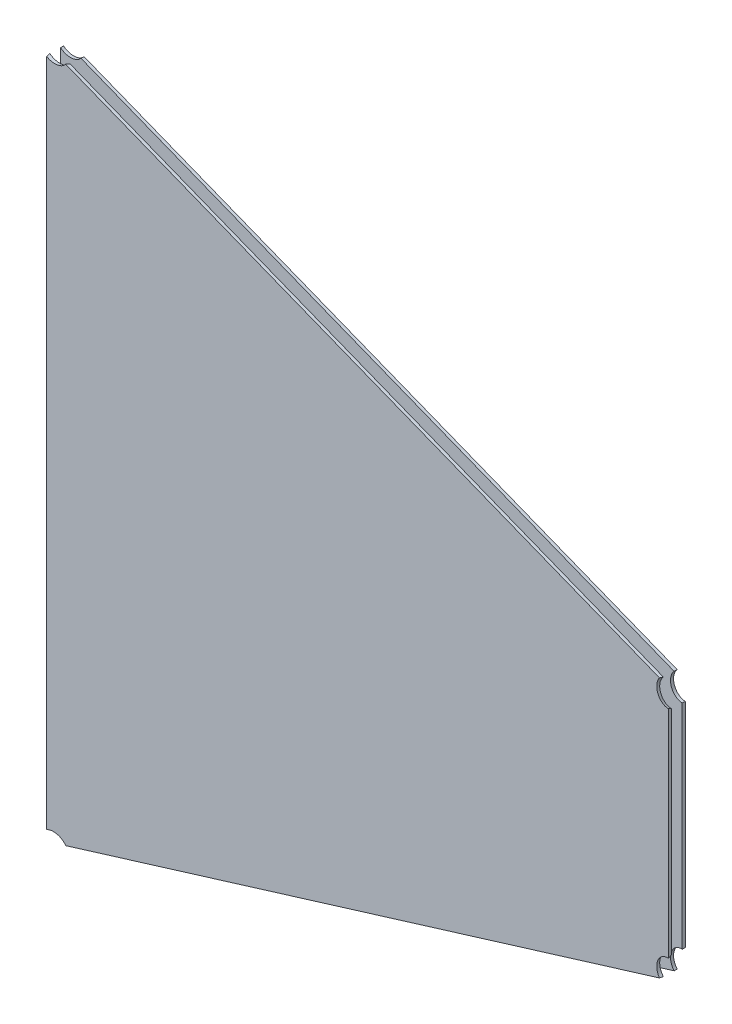
ISO-10303-21;
HEADER;
FILE_DESCRIPTION(('STEP AP214'),'2;1');
FILE_NAME('part.step','',(''),(''),'','','');
FILE_SCHEMA(('AUTOMOTIVE_DESIGN { 1 0 10303 214 1 1 1 1 }'));
ENDSEC;
DATA;
#1=APPLICATION_CONTEXT('core data for automotive mechanical design processes');
#2=APPLICATION_PROTOCOL_DEFINITION('international standard','automotive_design',2000,#1);
#3=PRODUCT_CONTEXT('',#1,'mechanical');
#4=PRODUCT('Part','Part','',(#3));
#5=PRODUCT_RELATED_PRODUCT_CATEGORY('part','',(#4));
#6=PRODUCT_DEFINITION_FORMATION('','',#4);
#7=PRODUCT_DEFINITION_CONTEXT('part definition',#1,'design');
#8=PRODUCT_DEFINITION('design','',#6,#7);
#9=PRODUCT_DEFINITION_SHAPE('','',#8);
#10=(LENGTH_UNIT() NAMED_UNIT(*) SI_UNIT(.MILLI.,.METRE.));
#11=(NAMED_UNIT(*) PLANE_ANGLE_UNIT() SI_UNIT($,.RADIAN.));
#12=(NAMED_UNIT(*) SI_UNIT($,.STERADIAN.) SOLID_ANGLE_UNIT());
#13=UNCERTAINTY_MEASURE_WITH_UNIT(LENGTH_MEASURE(1.E-05),#10,'distance_accuracy_value','');
#14=(GEOMETRIC_REPRESENTATION_CONTEXT(3) GLOBAL_UNCERTAINTY_ASSIGNED_CONTEXT((#13)) GLOBAL_UNIT_ASSIGNED_CONTEXT((#10,
#11,#12)) REPRESENTATION_CONTEXT('',''));
#15=CARTESIAN_POINT('',(0.,0.,0.));
#16=DIRECTION('',(0.,0.,1.));
#17=DIRECTION('',(1.,0.,0.));
#18=AXIS2_PLACEMENT_3D('',#15,#16,#17);
#19=CARTESIAN_POINT('',(220.7919090612,-370.332,-44.7861844499826));
#20=DIRECTION('',(0.0421154587053455,0.,-0.999112750463149));
#21=DIRECTION('',(-0.999112750463149,0.,-0.0421154587053455));
#22=AXIS2_PLACEMENT_3D('',#19,#20,#21);
#23=ELLIPSE('',#22,15.4594108181605,13.081);
#24=DIRECTION('',(-0.0421154587053455,0.,0.999112750463149));
#25=VECTOR('',#24,1.);
#26=SURFACE_OF_LINEAR_EXTRUSION('',#23,#25);
#27=CARTESIAN_POINT('',(220.65819247981,-370.332,-41.6140014672621));
#28=DIRECTION('',(0.0421154587053455,0.,-0.999112750463149));
#29=DIRECTION('',(-0.999112750463149,0.,-0.0421154587053455));
#30=AXIS2_PLACEMENT_3D('',#27,#28,#29);
#31=ELLIPSE('',#30,15.4594108181605,13.081);
#32=CARTESIAN_POINT('',(210.288066325558,-360.637647396048,-42.0511319308821));
#33=VERTEX_POINT('',#32);
#34=CARTESIAN_POINT('',(233.155342666991,-362.64472104543,-41.087210859897));
#35=VERTEX_POINT('',#34);
#36=EDGE_CURVE('E206',#33,#35,#31,.T.);
#37=ORIENTED_EDGE('',*,*,#36,.F.);
#38=DIRECTION('',(-0.0421154587053455,0.,0.999112750463149));
#39=VECTOR('',#38,1.);
#40=CARTESIAN_POINT('',(210.421782906947,-360.637647396048,-45.2233149136026));
#41=LINE('',#40,#39);
#42=CARTESIAN_POINT('',(210.421782906947,-360.637647396048,-45.2233149136026));
#43=VERTEX_POINT('',#42);
#44=EDGE_CURVE('E12',#43,#33,#41,.T.);
#45=ORIENTED_EDGE('',*,*,#44,.F.);
#46=CARTESIAN_POINT('',(233.28905924838,-362.64472104543,-44.2593938426175));
#47=VERTEX_POINT('',#46);
#48=EDGE_CURVE('E194',#43,#47,#23,.T.);
#49=ORIENTED_EDGE('',*,*,#48,.T.);
#50=DIRECTION('',(-0.0421154587053455,0.,0.999112750463149));
#51=VECTOR('',#50,1.);
#52=CARTESIAN_POINT('',(233.28905924838,-362.64472104543,-44.2593938426175));
#53=LINE('',#52,#51);
#54=EDGE_CURVE('E52',#47,#35,#53,.T.);
#55=ORIENTED_EDGE('',*,*,#54,.T.);
#56=EDGE_LOOP('',(#37,#45,#49,#55));
#57=FACE_BOUND('',#56,.T.);
#58=ADVANCED_FACE('F48',(#57),#26,.T.);
#59=CARTESIAN_POINT('',(210.421782906947,360.637647396048,-45.2233149136026));
#60=DIRECTION('',(-0.999112750463149,0.,-0.0421154587053455));
#61=DIRECTION('',(-0.0421154587053455,0.,0.999112750463149));
#62=AXIS2_PLACEMENT_3D('',#59,#60,#61);
#63=PLANE('',#62);
#64=DIRECTION('',(0.,-1.,0.));
#65=VECTOR('',#64,1.);
#66=CARTESIAN_POINT('',(210.288066325558,360.637647396048,-42.0511319308821));
#67=LINE('',#66,#65);
#68=CARTESIAN_POINT('',(210.288066325558,360.637647396048,-42.0511319308821));
#69=VERTEX_POINT('',#68);
#70=EDGE_CURVE('E191',#69,#33,#67,.T.);
#71=ORIENTED_EDGE('',*,*,#70,.F.);
#72=DIRECTION('',(-0.0421154587053455,0.,0.999112750463149));
#73=VECTOR('',#72,1.);
#74=CARTESIAN_POINT('',(210.421782906947,360.637647396048,-45.2233149136026));
#75=LINE('',#74,#73);
#76=CARTESIAN_POINT('',(210.421782906947,360.637647396048,-45.2233149136026));
#77=VERTEX_POINT('',#76);
#78=EDGE_CURVE('E58',#77,#69,#75,.T.);
#79=ORIENTED_EDGE('',*,*,#78,.F.);
#80=DIRECTION('',(0.,-1.,0.));
#81=VECTOR('',#80,1.);
#82=CARTESIAN_POINT('',(210.421782906947,360.637647396048,-45.2233149136026));
#83=LINE('',#82,#81);
#84=EDGE_CURVE('E136',#77,#43,#83,.T.);
#85=ORIENTED_EDGE('',*,*,#84,.T.);
#86=ORIENTED_EDGE('',*,*,#44,.T.);
#87=EDGE_LOOP('',(#71,#79,#85,#86));
#88=FACE_BOUND('',#87,.T.);
#89=ADVANCED_FACE('F152',(#88),#63,.T.);
#90=CARTESIAN_POINT('',(220.7919090612,370.332,-44.7861844499826));
#91=DIRECTION('',(0.0421154587053455,0.,-0.999112750463149));
#92=DIRECTION('',(-0.999112750463149,0.,-0.0421154587053455));
#93=AXIS2_PLACEMENT_3D('',#90,#91,#92);
#94=ELLIPSE('',#93,15.4594108181605,13.081);
#95=DIRECTION('',(-0.0421154587053455,0.,0.999112750463149));
#96=VECTOR('',#95,1.);
#97=SURFACE_OF_LINEAR_EXTRUSION('',#94,#96);
#98=CARTESIAN_POINT('',(220.65819247981,370.332,-41.6140014672621));
#99=DIRECTION('',(0.0421154587053455,0.,-0.999112750463149));
#100=DIRECTION('',(-0.999112750463149,0.,-0.0421154587053455));
#101=AXIS2_PLACEMENT_3D('',#98,#99,#100);
#102=ELLIPSE('',#101,15.4594108181605,13.081);
#103=CARTESIAN_POINT('',(233.155342666991,362.64472104543,-41.087210859897));
#104=VERTEX_POINT('',#103);
#105=EDGE_CURVE('E123',#104,#69,#102,.T.);
#106=ORIENTED_EDGE('',*,*,#105,.F.);
#107=DIRECTION('',(-0.0421154587053455,0.,0.999112750463149));
#108=VECTOR('',#107,1.);
#109=CARTESIAN_POINT('',(233.28905924838,362.64472104543,-44.2593938426175));
#110=LINE('',#109,#108);
#111=CARTESIAN_POINT('',(233.28905924838,362.64472104543,-44.2593938426175));
#112=VERTEX_POINT('',#111);
#113=EDGE_CURVE('E118',#112,#104,#110,.T.);
#114=ORIENTED_EDGE('',*,*,#113,.F.);
#115=EDGE_CURVE('E121',#112,#77,#94,.T.);
#116=ORIENTED_EDGE('',*,*,#115,.T.);
#117=ORIENTED_EDGE('',*,*,#78,.T.);
#118=EDGE_LOOP('',(#106,#114,#116,#117));
#119=FACE_BOUND('',#118,.T.);
#120=ADVANCED_FACE('F120',(#119),#97,.T.);
#121=CARTESIAN_POINT('',(897.931496197148,139.212260546722,-16.2428150389137));
#122=DIRECTION('',(0.318109621597618,0.947959103125635,0.0134092299652438));
#123=DIRECTION('',(-0.948044339674127,0.318138224694627,0.));
#124=AXIS2_PLACEMENT_3D('',#121,#122,#123);
#125=PLANE('',#124);
#126=DIRECTION('',(-0.947118026850434,0.318392114854059,-0.039923732462044));
#127=VECTOR('',#126,1.);
#128=CARTESIAN_POINT('',(897.797779615758,139.212260546722,-13.0706320561932));
#129=LINE('',#128,#127);
#130=CARTESIAN_POINT('',(897.797779615758,139.212260546722,-13.0706320561932));
#131=VERTEX_POINT('',#130);
#132=EDGE_CURVE('E196',#131,#104,#129,.T.);
#133=ORIENTED_EDGE('',*,*,#132,.F.);
#134=DIRECTION('',(-0.0421154587053455,0.,0.999112750463149));
#135=VECTOR('',#134,1.);
#136=CARTESIAN_POINT('',(897.931496197148,139.212260546722,-16.2428150389137));
#137=LINE('',#136,#135);
#138=CARTESIAN_POINT('',(897.931496197148,139.212260546722,-16.2428150389137));
#139=VERTEX_POINT('',#138);
#140=EDGE_CURVE('E128',#139,#131,#137,.T.);
#141=ORIENTED_EDGE('',*,*,#140,.F.);
#142=DIRECTION('',(-0.947118026850434,0.318392114854059,-0.039923732462044));
#143=VECTOR('',#142,1.);
#144=CARTESIAN_POINT('',(897.931496197148,139.212260546722,-16.2428150389137));
#145=LINE('',#144,#143);
#146=EDGE_CURVE('E134',#139,#112,#145,.T.);
#147=ORIENTED_EDGE('',*,*,#146,.T.);
#148=ORIENTED_EDGE('',*,*,#113,.T.);
#149=EDGE_LOOP('',(#133,#141,#147,#148));
#150=FACE_BOUND('',#149,.T.);
#151=ADVANCED_FACE('F138',(#150),#125,.T.);
#152=CARTESIAN_POINT('',(906.924524616252,128.906498481503,-15.8637331816907));
#153=DIRECTION('',(0.0421154587053455,0.,-0.999112750463149));
#154=DIRECTION('',(0.0898112047401349,0.995951612895329,0.00378579903294908));
#155=AXIS2_PLACEMENT_3D('',#152,#153,#154);
#156=ELLIPSE('',#155,14.4478349811073,13.0810000000001);
#157=DIRECTION('',(-0.0421154587053455,0.,0.999112750463149));
#158=VECTOR('',#157,1.);
#159=SURFACE_OF_LINEAR_EXTRUSION('',#156,#158);
#160=CARTESIAN_POINT('',(906.790808034863,128.906498481503,-12.6915501989702));
#161=DIRECTION('',(0.0421154587053455,0.,-0.999112750463149));
#162=DIRECTION('',(0.0898112047401349,0.995951612895329,0.00378579903294908));
#163=AXIS2_PLACEMENT_3D('',#160,#161,#162);
#164=ELLIPSE('',#163,14.4478349811073,13.0810000000001);
#165=CARTESIAN_POINT('',(906.857666325557,114.472985943396,-12.6887319308823));
#166=VERTEX_POINT('',#165);
#167=EDGE_CURVE('E198',#166,#131,#164,.T.);
#168=ORIENTED_EDGE('',*,*,#167,.F.);
#169=DIRECTION('',(-0.0421154587053455,0.,0.999112750463149));
#170=VECTOR('',#169,1.);
#171=CARTESIAN_POINT('',(906.991382906947,114.472985943396,-15.8609149136028));
#172=LINE('',#171,#170);
#173=CARTESIAN_POINT('',(906.991382906947,114.472985943396,-15.8609149136028));
#174=VERTEX_POINT('',#173);
#175=EDGE_CURVE('E177',#174,#166,#172,.T.);
#176=ORIENTED_EDGE('',*,*,#175,.F.);
#177=EDGE_CURVE('E139',#174,#139,#156,.T.);
#178=ORIENTED_EDGE('',*,*,#177,.T.);
#179=ORIENTED_EDGE('',*,*,#140,.T.);
#180=EDGE_LOOP('',(#168,#176,#178,#179));
#181=FACE_BOUND('',#180,.T.);
#182=ADVANCED_FACE('F156',(#181),#159,.T.);
#183=CARTESIAN_POINT('',(906.991382906947,-114.472985943396,-15.8609149136028));
#184=DIRECTION('',(0.999112750463149,0.,0.0421154587053455));
#185=DIRECTION('',(0.0421154587053455,0.,-0.999112750463149));
#186=AXIS2_PLACEMENT_3D('',#183,#184,#185);
#187=PLANE('',#186);
#188=DIRECTION('',(0.,1.,0.));
#189=VECTOR('',#188,1.);
#190=CARTESIAN_POINT('',(906.857666325557,-114.472985943396,-12.6887319308823));
#191=LINE('',#190,#189);
#192=CARTESIAN_POINT('',(906.857666325557,-114.472985943396,-12.6887319308823));
#193=VERTEX_POINT('',#192);
#194=EDGE_CURVE('E201',#193,#166,#191,.T.);
#195=ORIENTED_EDGE('',*,*,#194,.F.);
#196=DIRECTION('',(-0.0421154587053455,0.,0.999112750463149));
#197=VECTOR('',#196,1.);
#198=CARTESIAN_POINT('',(906.991382906947,-114.472985943396,-15.8609149136028));
#199=LINE('',#198,#197);
#200=CARTESIAN_POINT('',(906.991382906947,-114.472985943396,-15.8609149136028));
#201=VERTEX_POINT('',#200);
#202=EDGE_CURVE('E179',#201,#193,#199,.T.);
#203=ORIENTED_EDGE('',*,*,#202,.F.);
#204=DIRECTION('',(0.,1.,0.));
#205=VECTOR('',#204,1.);
#206=CARTESIAN_POINT('',(906.991382906947,-114.472985943396,-15.8609149136028));
#207=LINE('',#206,#205);
#208=EDGE_CURVE('E141',#201,#174,#207,.T.);
#209=ORIENTED_EDGE('',*,*,#208,.T.);
#210=ORIENTED_EDGE('',*,*,#175,.T.);
#211=EDGE_LOOP('',(#195,#203,#209,#210));
#212=FACE_BOUND('',#211,.T.);
#213=ADVANCED_FACE('F159',(#212),#187,.T.);
#214=CARTESIAN_POINT('',(906.924524616252,-128.906498481503,-15.8637331816907));
#215=DIRECTION('',(0.0421154587053455,0.,-0.999112750463149));
#216=DIRECTION('',(0.0898112047401349,-0.995951612895329,0.00378579903294908));
#217=AXIS2_PLACEMENT_3D('',#214,#215,#216);
#218=ELLIPSE('',#217,14.4478349811073,13.0810000000001);
#219=DIRECTION('',(-0.0421154587053455,0.,0.999112750463149));
#220=VECTOR('',#219,1.);
#221=SURFACE_OF_LINEAR_EXTRUSION('',#218,#220);
#222=CARTESIAN_POINT('',(906.790808034863,-128.906498481503,-12.6915501989702));
#223=DIRECTION('',(0.0421154587053455,0.,-0.999112750463149));
#224=DIRECTION('',(0.0898112047401349,-0.995951612895329,0.00378579903294908));
#225=AXIS2_PLACEMENT_3D('',#222,#223,#224);
#226=ELLIPSE('',#225,14.4478349811073,13.0810000000001);
#227=CARTESIAN_POINT('',(897.797779615758,-139.212260546722,-13.0706320561932));
#228=VERTEX_POINT('',#227);
#229=EDGE_CURVE('E184',#228,#193,#226,.T.);
#230=ORIENTED_EDGE('',*,*,#229,.F.);
#231=DIRECTION('',(-0.0421154587053455,0.,0.999112750463149));
#232=VECTOR('',#231,1.);
#233=CARTESIAN_POINT('',(897.931496197148,-139.212260546722,-16.2428150389137));
#234=LINE('',#233,#232);
#235=CARTESIAN_POINT('',(897.931496197148,-139.212260546722,-16.2428150389137));
#236=VERTEX_POINT('',#235);
#237=EDGE_CURVE('E182',#236,#228,#234,.T.);
#238=ORIENTED_EDGE('',*,*,#237,.F.);
#239=EDGE_CURVE('E169',#236,#201,#218,.T.);
#240=ORIENTED_EDGE('',*,*,#239,.T.);
#241=ORIENTED_EDGE('',*,*,#202,.T.);
#242=EDGE_LOOP('',(#230,#238,#240,#241));
#243=FACE_BOUND('',#242,.T.);
#244=ADVANCED_FACE('F163',(#243),#221,.T.);
#245=CARTESIAN_POINT('',(233.28905924838,-362.64472104543,-44.2593938426175));
#246=DIRECTION('',(0.318109621597618,-0.947959103125635,0.0134092299652438));
#247=DIRECTION('',(0.948044339674127,0.318138224694627,0.));
#248=AXIS2_PLACEMENT_3D('',#245,#246,#247);
#249=PLANE('',#248);
#250=DIRECTION('',(0.947118026850434,0.31839211485406,0.0399237324620441));
#251=VECTOR('',#250,1.);
#252=CARTESIAN_POINT('',(233.155342666991,-362.64472104543,-41.087210859897));
#253=LINE('',#252,#251);
#254=EDGE_CURVE('E205',#35,#228,#253,.T.);
#255=ORIENTED_EDGE('',*,*,#254,.F.);
#256=ORIENTED_EDGE('',*,*,#54,.F.);
#257=DIRECTION('',(0.947118026850434,0.31839211485406,0.0399237324620441));
#258=VECTOR('',#257,1.);
#259=CARTESIAN_POINT('',(233.28905924838,-362.64472104543,-44.2593938426175));
#260=LINE('',#259,#258);
#261=EDGE_CURVE('E173',#47,#236,#260,.T.);
#262=ORIENTED_EDGE('',*,*,#261,.T.);
#263=ORIENTED_EDGE('',*,*,#237,.T.);
#264=EDGE_LOOP('',(#255,#256,#262,#263));
#265=FACE_BOUND('',#264,.T.);
#266=ADVANCED_FACE('F167',(#265),#249,.T.);
#267=CARTESIAN_POINT('',(220.7919090612,-370.332,-44.7861844499826));
#268=DIRECTION('',(-0.0421154587053455,0.,0.999112750463149));
#269=DIRECTION('',(0.999112750463149,0.,0.0421154587053455));
#270=AXIS2_PLACEMENT_3D('',#267,#268,#269);
#271=PLANE('',#270);
#272=ORIENTED_EDGE('',*,*,#48,.F.);
#273=ORIENTED_EDGE('',*,*,#84,.F.);
#274=ORIENTED_EDGE('',*,*,#115,.F.);
#275=ORIENTED_EDGE('',*,*,#146,.F.);
#276=ORIENTED_EDGE('',*,*,#177,.F.);
#277=ORIENTED_EDGE('',*,*,#208,.F.);
#278=ORIENTED_EDGE('',*,*,#239,.F.);
#279=ORIENTED_EDGE('',*,*,#261,.F.);
#280=EDGE_LOOP('',(#272,#273,#274,#275,#276,#277,#278,#279));
#281=FACE_BOUND('',#280,.T.);
#282=ADVANCED_FACE('F132',(#281),#271,.F.);
#283=CARTESIAN_POINT('',(220.65819247981,-370.332,-41.6140014672621));
#284=DIRECTION('',(-0.0421154587053455,0.,0.999112750463149));
#285=DIRECTION('',(0.999112750463149,0.,0.0421154587053455));
#286=AXIS2_PLACEMENT_3D('',#283,#284,#285);
#287=PLANE('',#286);
#288=ORIENTED_EDGE('',*,*,#36,.T.);
#289=ORIENTED_EDGE('',*,*,#254,.T.);
#290=ORIENTED_EDGE('',*,*,#229,.T.);
#291=ORIENTED_EDGE('',*,*,#194,.T.);
#292=ORIENTED_EDGE('',*,*,#167,.T.);
#293=ORIENTED_EDGE('',*,*,#132,.T.);
#294=ORIENTED_EDGE('',*,*,#105,.T.);
#295=ORIENTED_EDGE('',*,*,#70,.T.);
#296=EDGE_LOOP('',(#288,#289,#290,#291,#292,#293,#294,#295));
#297=FACE_BOUND('',#296,.T.);
#298=ADVANCED_FACE('F209',(#297),#287,.T.);
#299=CLOSED_SHELL('',(#58,#89,#120,#151,#182,#213,#244,#266,#282,#298));
#300=MANIFOLD_SOLID_BREP('B2',#299);
#301=CARTESIAN_POINT('',(209.686341709305,-370.332,-27.7763085086399));
#302=DIRECTION('',(0.999112750463149,0.,0.0421154587053455));
#303=DIRECTION('',(0.0421154587053455,0.,-0.999112750463149));
#304=AXIS2_PLACEMENT_3D('',#301,#302,#303);
#305=PLANE('',#304);
#306=DIRECTION('',(0.,-1.,0.));
#307=VECTOR('',#306,1.);
#308=CARTESIAN_POINT('',(209.820058290695,-370.332,-30.9484914913604));
#309=LINE('',#308,#307);
#310=CARTESIAN_POINT('',(209.820058290695,360.637647396048,-30.9484914913604));
#311=VERTEX_POINT('',#310);
#312=CARTESIAN_POINT('',(209.820058290695,-360.637647396048,-30.9484914913604));
#313=VERTEX_POINT('',#312);
#314=EDGE_CURVE('E360',#311,#313,#309,.T.);
#315=ORIENTED_EDGE('',*,*,#314,.T.);
#316=CARTESIAN_POINT('',(209.126027923583,-370.332,-14.4838818134439));
#317=DIRECTION('',(0.999112750463149,0.,0.0421154587053455));
#318=DIRECTION('',(-0.0421154587053455,0.,0.999112750463149));
#319=AXIS2_PLACEMENT_3D('',#316,#317,#318);
#320=ELLIPSE('',#319,24.5448474961114,13.081);
#321=CARTESIAN_POINT('',(209.686341709305,-359.339326472274,-27.7763085086399));
#322=VERTEX_POINT('',#321);
#323=EDGE_CURVE('E292',#313,#322,#320,.T.);
#324=ORIENTED_EDGE('',*,*,#323,.T.);
#325=DIRECTION('',(0.,-1.,0.));
#326=VECTOR('',#325,1.);
#327=CARTESIAN_POINT('',(209.686341709305,-370.332,-27.7763085086399));
#328=LINE('',#327,#326);
#329=CARTESIAN_POINT('',(209.686341709305,359.339326472274,-27.7763085086399));
#330=VERTEX_POINT('',#329);
#331=EDGE_CURVE('E370',#330,#322,#328,.T.);
#332=ORIENTED_EDGE('',*,*,#331,.F.);
#333=CARTESIAN_POINT('',(209.126027923583,370.332,-14.4838818134439));
#334=DIRECTION('',(0.999112750463149,0.,0.0421154587053455));
#335=DIRECTION('',(-0.0421154587053455,0.,0.999112750463149));
#336=AXIS2_PLACEMENT_3D('',#333,#334,#335);
#337=ELLIPSE('',#336,24.5448474961114,13.081);
#338=EDGE_CURVE('E416',#311,#330,#337,.F.);
#339=ORIENTED_EDGE('',*,*,#338,.F.);
#340=EDGE_LOOP('',(#315,#324,#332,#339));
#341=FACE_BOUND('',#340,.T.);
#342=ADVANCED_FACE('F279',(#341),#305,.F.);
#343=CARTESIAN_POINT('',(209.686341709305,-370.332,-27.7763085086399));
#344=DIRECTION('',(-0.318109621597618,0.947959103125635,-0.0134092299652438));
#345=DIRECTION('',(-0.948044339674127,-0.318138224694627,0.));
#346=AXIS2_PLACEMENT_3D('',#343,#344,#345);
#347=PLANE('',#346);
#348=DIRECTION('',(0.947118026850434,0.31839211485406,0.0399237324620441));
#349=VECTOR('',#348,1.);
#350=CARTESIAN_POINT('',(209.686341709305,-370.332,-27.7763085086399));
#351=LINE('',#350,#349);
#352=CARTESIAN_POINT('',(230.984995216745,-363.172044068923,-26.8785093745019));
#353=VERTEX_POINT('',#352);
#354=CARTESIAN_POINT('',(896.327291486187,-139.504312270448,1.167570500333));
#355=VERTEX_POINT('',#354);
#356=EDGE_CURVE('E353',#353,#355,#351,.T.);
#357=ORIENTED_EDGE('',*,*,#356,.F.);
#358=CARTESIAN_POINT('',(209.126027923583,-370.332,-14.4838818134439));
#359=DIRECTION('',(-0.318109621597618,0.947959103125635,-0.0134092299652438));
#360=DIRECTION('',(-0.521693031659476,-0.163221210533264,0.837374000760712));
#361=AXIS2_PLACEMENT_3D('',#358,#359,#360);
#362=ELLIPSE('',#361,77.0899979962189,13.081);
#363=CARTESIAN_POINT('',(232.687334632128,-362.64472104543,-29.9845704203752));
#364=VERTEX_POINT('',#363);
#365=EDGE_CURVE('E341',#353,#364,#362,.T.);
#366=ORIENTED_EDGE('',*,*,#365,.T.);
#367=DIRECTION('',(0.947118026850434,0.31839211485406,0.0399237324620441));
#368=VECTOR('',#367,1.);
#369=CARTESIAN_POINT('',(209.820058290695,-370.332,-30.9484914913604));
#370=LINE('',#369,#368);
#371=CARTESIAN_POINT('',(897.329771580895,-139.212260546722,-1.96799161667147));
#372=VERTEX_POINT('',#371);
#373=EDGE_CURVE('E351',#364,#372,#370,.T.);
#374=ORIENTED_EDGE('',*,*,#373,.T.);
#375=CARTESIAN_POINT('',(906.3228,-135.974807146923,13.5589666356401));
#376=DIRECTION('',(-0.318109621597618,0.947959103125635,-0.0134092299652438));
#377=DIRECTION('',(-0.144255657337242,-0.0344193819005481,0.98894166232179));
#378=AXIS2_PLACEMENT_3D('',#375,#376,#377);
#379=ELLIPSE('',#378,31.6733576513201,13.0810000000001);
#380=EDGE_CURVE('E392',#355,#372,#379,.F.);
#381=ORIENTED_EDGE('',*,*,#380,.F.);
#382=EDGE_LOOP('',(#357,#366,#374,#381));
#383=FACE_BOUND('',#382,.T.);
#384=ADVANCED_FACE('F349',(#383),#347,.F.);
#385=CARTESIAN_POINT('',(906.255941709305,-136.166603714,1.58609149135999));
#386=DIRECTION('',(-0.999112750463149,0.,-0.0421154587053455));
#387=DIRECTION('',(-0.0421154587053455,0.,0.999112750463149));
#388=AXIS2_PLACEMENT_3D('',#385,#386,#387);
#389=PLANE('',#388);
#390=CARTESIAN_POINT('',(906.3228,-129.647916243856,-5.77315972805081E-12));
#391=DIRECTION('',(-0.999112750463149,0.,-0.0421154587053455));
#392=DIRECTION('',(-0.0381589335137072,-0.423159353994927,0.905251377750784));
#393=AXIS2_PLACEMENT_3D('',#390,#391,#392);
#394=ELLIPSE('',#393,342.748638859764,13.0810000000001);
#395=CARTESIAN_POINT('',(906.389658290694,-114.472985943396,-1.58609149136051));
#396=VERTEX_POINT('',#395);
#397=CARTESIAN_POINT('',(906.255941709305,-115.953191345146,1.58609149135999));
#398=VERTEX_POINT('',#397);
#399=EDGE_CURVE('E413',#396,#398,#394,.F.);
#400=ORIENTED_EDGE('',*,*,#399,.F.);
#401=DIRECTION('',(0.,1.,0.));
#402=VECTOR('',#401,1.);
#403=CARTESIAN_POINT('',(906.389658290694,-136.166603714,-1.58609149136051));
#404=LINE('',#403,#402);
#405=CARTESIAN_POINT('',(906.389658290694,114.472985943396,-1.58609149136051));
#406=VERTEX_POINT('',#405);
#407=EDGE_CURVE('E359',#396,#406,#404,.T.);
#408=ORIENTED_EDGE('',*,*,#407,.T.);
#409=CARTESIAN_POINT('',(906.3228,129.647916243857,-3.24740234702858E-12));
#410=DIRECTION('',(-0.999112750463149,0.,-0.0421154587053455));
#411=DIRECTION('',(-0.0381589335137069,0.423159353994927,0.905251377750784));
#412=AXIS2_PLACEMENT_3D('',#409,#410,#411);
#413=ELLIPSE('',#412,342.748638859767,13.0810000000001);
#414=CARTESIAN_POINT('',(906.255941709305,115.953191345146,1.58609149135999));
#415=VERTEX_POINT('',#414);
#416=EDGE_CURVE('E386',#406,#415,#413,.T.);
#417=ORIENTED_EDGE('',*,*,#416,.T.);
#418=DIRECTION('',(0.,1.,0.));
#419=VECTOR('',#418,1.);
#420=CARTESIAN_POINT('',(906.255941709305,-136.166603714,1.58609149135999));
#421=LINE('',#420,#419);
#422=EDGE_CURVE('E400',#398,#415,#421,.T.);
#423=ORIENTED_EDGE('',*,*,#422,.F.);
#424=EDGE_LOOP('',(#400,#408,#417,#423));
#425=FACE_BOUND('',#424,.T.);
#426=ADVANCED_FACE('F412',(#425),#389,.F.);
#427=CARTESIAN_POINT('',(209.686341709305,370.332,-27.7763085086399));
#428=DIRECTION('',(-0.318109621597618,-0.947959103125635,-0.0134092299652438));
#429=DIRECTION('',(0.948044339674127,-0.318138224694627,0.));
#430=AXIS2_PLACEMENT_3D('',#427,#428,#429);
#431=PLANE('',#430);
#432=CARTESIAN_POINT('',(209.126027923583,370.332,-14.4838818134439));
#433=DIRECTION('',(-0.318109621597618,-0.947959103125635,-0.0134092299652438));
#434=DIRECTION('',(-0.521693031659476,0.163221210533264,0.837374000760712));
#435=AXIS2_PLACEMENT_3D('',#432,#433,#434);
#436=ELLIPSE('',#435,77.089997996219,13.081);
#437=CARTESIAN_POINT('',(230.984995216745,363.172044068923,-26.8785093745019));
#438=VERTEX_POINT('',#437);
#439=CARTESIAN_POINT('',(232.687334632128,362.64472104543,-29.9845704203752));
#440=VERTEX_POINT('',#439);
#441=EDGE_CURVE('E300',#438,#440,#436,.F.);
#442=ORIENTED_EDGE('',*,*,#441,.F.);
#443=DIRECTION('',(-0.947118026850433,0.318392114854059,-0.0399237324620441));
#444=VECTOR('',#443,1.);
#445=CARTESIAN_POINT('',(209.686341709305,370.332,-27.7763085086399));
#446=LINE('',#445,#444);
#447=CARTESIAN_POINT('',(896.327291486187,139.504312270448,1.167570500333));
#448=VERTEX_POINT('',#447);
#449=EDGE_CURVE('E373',#448,#438,#446,.T.);
#450=ORIENTED_EDGE('',*,*,#449,.F.);
#451=CARTESIAN_POINT('',(906.3228,135.974807146923,13.5589666356402));
#452=DIRECTION('',(-0.318109621597618,-0.947959103125635,-0.0134092299652438));
#453=DIRECTION('',(-0.144255657337242,0.0344193819005481,0.98894166232179));
#454=AXIS2_PLACEMENT_3D('',#451,#452,#453);
#455=ELLIPSE('',#454,31.6733576513201,13.0810000000001);
#456=CARTESIAN_POINT('',(897.329771580895,139.212260546722,-1.96799161667147));
#457=VERTEX_POINT('',#456);
#458=EDGE_CURVE('E382',#448,#457,#455,.T.);
#459=ORIENTED_EDGE('',*,*,#458,.T.);
#460=DIRECTION('',(-0.947118026850433,0.318392114854059,-0.0399237324620441));
#461=VECTOR('',#460,1.);
#462=CARTESIAN_POINT('',(209.820058290695,370.332,-30.9484914913604));
#463=LINE('',#462,#461);
#464=EDGE_CURVE('E362',#457,#440,#463,.T.);
#465=ORIENTED_EDGE('',*,*,#464,.T.);
#466=EDGE_LOOP('',(#442,#450,#459,#465));
#467=FACE_BOUND('',#466,.T.);
#468=ADVANCED_FACE('F379',(#467),#431,.F.);
#469=CARTESIAN_POINT('',(1.54069721043158,0.,-36.550242473076));
#470=DIRECTION('',(0.0421154587053455,0.,-0.999112750463149));
#471=DIRECTION('',(-0.999112750463149,0.,-0.0421154587053455));
#472=AXIS2_PLACEMENT_3D('',#469,#470,#471);
#473=PLANE('',#472);
#474=ORIENTED_EDGE('',*,*,#331,.T.);
#475=CARTESIAN_POINT('',(218.058489268334,-370.332,-27.4233985546493));
#476=DIRECTION('',(0.0421154587053455,0.,-0.999112750463149));
#477=DIRECTION('',(-0.999112750463149,0.,-0.0421154587053455));
#478=AXIS2_PLACEMENT_3D('',#475,#476,#477);
#479=ELLIPSE('',#478,15.4594108181605,13.081);
#480=EDGE_CURVE('E421',#322,#353,#479,.T.);
#481=ORIENTED_EDGE('',*,*,#480,.T.);
#482=ORIENTED_EDGE('',*,*,#356,.T.);
#483=CARTESIAN_POINT('',(906.3228,-130.389334006213,1.58890975944792));
#484=DIRECTION('',(0.0421154587053455,0.,-0.999112750463149));
#485=DIRECTION('',(0.0898112047401361,-0.995951612895329,0.00378579903294913));
#486=AXIS2_PLACEMENT_3D('',#483,#484,#485);
#487=ELLIPSE('',#486,14.4478349811073,13.0810000000001);
#488=EDGE_CURVE('E387',#398,#355,#487,.F.);
#489=ORIENTED_EDGE('',*,*,#488,.F.);
#490=ORIENTED_EDGE('',*,*,#422,.T.);
#491=CARTESIAN_POINT('',(906.3228,130.389334006213,1.58890975944792));
#492=DIRECTION('',(0.0421154587053455,0.,-0.999112750463149));
#493=DIRECTION('',(0.0898112047401361,0.995951612895329,0.00378579903294913));
#494=AXIS2_PLACEMENT_3D('',#491,#492,#493);
#495=ELLIPSE('',#494,14.4478349811073,13.0810000000001);
#496=EDGE_CURVE('E364',#415,#448,#495,.T.);
#497=ORIENTED_EDGE('',*,*,#496,.T.);
#498=ORIENTED_EDGE('',*,*,#449,.T.);
#499=CARTESIAN_POINT('',(218.058489268334,370.332,-27.4233985546493));
#500=DIRECTION('',(0.0421154587053455,0.,-0.999112750463149));
#501=DIRECTION('',(-0.999112750463149,0.,-0.0421154587053455));
#502=AXIS2_PLACEMENT_3D('',#499,#500,#501);
#503=ELLIPSE('',#502,15.4594108181605,13.081);
#504=EDGE_CURVE('E404',#330,#438,#503,.F.);
#505=ORIENTED_EDGE('',*,*,#504,.F.);
#506=EDGE_LOOP('',(#474,#481,#482,#489,#490,#497,#498,#505));
#507=FACE_BOUND('',#506,.T.);
#508=ADVANCED_FACE('F403',(#507),#473,.F.);
#509=CARTESIAN_POINT('',(1.67441379182105,0.,-39.7224254557965));
#510=DIRECTION('',(0.0421154587053455,0.,-0.999112750463149));
#511=DIRECTION('',(-0.999112750463149,0.,-0.0421154587053455));
#512=AXIS2_PLACEMENT_3D('',#509,#510,#511);
#513=PLANE('',#512);
#514=CARTESIAN_POINT('',(220.190184444947,-370.332,-30.5113610277403));
#515=DIRECTION('',(0.0421154587053455,0.,-0.999112750463149));
#516=DIRECTION('',(-0.999112750463149,0.,-0.0421154587053455));
#517=AXIS2_PLACEMENT_3D('',#514,#515,#516);
#518=ELLIPSE('',#517,15.4594108181605,13.081);
#519=EDGE_CURVE('E46',#313,#364,#518,.T.);
#520=ORIENTED_EDGE('',*,*,#519,.F.);
#521=ORIENTED_EDGE('',*,*,#314,.F.);
#522=CARTESIAN_POINT('',(220.190184444947,370.332,-30.5113610277403));
#523=DIRECTION('',(0.0421154587053455,0.,-0.999112750463149));
#524=DIRECTION('',(-0.999112750463149,0.,-0.0421154587053455));
#525=AXIS2_PLACEMENT_3D('',#522,#523,#524);
#526=ELLIPSE('',#525,15.4594108181605,13.081);
#527=EDGE_CURVE('E286',#311,#440,#526,.F.);
#528=ORIENTED_EDGE('',*,*,#527,.T.);
#529=ORIENTED_EDGE('',*,*,#464,.F.);
#530=CARTESIAN_POINT('',(906.3228,128.906498481503,-1.58890975944842));
#531=DIRECTION('',(0.0421154587053455,0.,-0.999112750463149));
#532=DIRECTION('',(0.0898112047401361,0.995951612895329,0.00378579903294913));
#533=AXIS2_PLACEMENT_3D('',#530,#531,#532);
#534=ELLIPSE('',#533,14.4478349811073,13.0810000000001);
#535=EDGE_CURVE('E371',#406,#457,#534,.T.);
#536=ORIENTED_EDGE('',*,*,#535,.F.);
#537=ORIENTED_EDGE('',*,*,#407,.F.);
#538=CARTESIAN_POINT('',(906.3228,-128.906498481503,-1.58890975944842));
#539=DIRECTION('',(0.0421154587053455,0.,-0.999112750463149));
#540=DIRECTION('',(0.0898112047401361,-0.995951612895329,0.00378579903294913));
#541=AXIS2_PLACEMENT_3D('',#538,#539,#540);
#542=ELLIPSE('',#541,14.4478349811073,13.0810000000001);
#543=EDGE_CURVE('E358',#396,#372,#542,.F.);
#544=ORIENTED_EDGE('',*,*,#543,.T.);
#545=ORIENTED_EDGE('',*,*,#373,.F.);
#546=EDGE_LOOP('',(#520,#521,#528,#529,#536,#537,#544,#545));
#547=FACE_BOUND('',#546,.T.);
#548=ADVANCED_FACE('F356',(#547),#513,.T.);
#549=CARTESIAN_POINT('',(906.3228,28.3909284385361,-217.000757609507));
#550=DIRECTION('',(0.,0.422851061753877,0.906199194202698));
#551=DIRECTION('',(0.,-0.906199194202698,0.422851061753877));
#552=AXIS2_PLACEMENT_3D('',#549,#550,#551);
#553=CYLINDRICAL_SURFACE('',#552,13.0810000000001);
#554=ORIENTED_EDGE('',*,*,#416,.F.);
#555=ORIENTED_EDGE('',*,*,#535,.T.);
#556=ORIENTED_EDGE('',*,*,#458,.F.);
#557=ORIENTED_EDGE('',*,*,#496,.F.);
#558=EDGE_LOOP('',(#554,#555,#556,#557));
#559=FACE_BOUND('',#558,.T.);
#560=ADVANCED_FACE('F409',(#559),#553,.F.);
#561=CARTESIAN_POINT('',(906.3228,-28.3909284385361,-217.000757609507));
#562=DIRECTION('',(0.,-0.422851061753877,0.906199194202698));
#563=DIRECTION('',(0.,-0.906199194202698,-0.422851061753877));
#564=AXIS2_PLACEMENT_3D('',#561,#562,#563);
#565=CYLINDRICAL_SURFACE('',#564,13.0810000000001);
#566=ORIENTED_EDGE('',*,*,#488,.T.);
#567=ORIENTED_EDGE('',*,*,#380,.T.);
#568=ORIENTED_EDGE('',*,*,#543,.F.);
#569=ORIENTED_EDGE('',*,*,#399,.T.);
#570=EDGE_LOOP('',(#566,#567,#568,#569));
#571=FACE_BOUND('',#570,.T.);
#572=ADVANCED_FACE('F424',(#571),#565,.F.);
#573=CARTESIAN_POINT('',(201.793737398577,370.332,-3.86236414458313));
#574=DIRECTION('',(-0.56810600552306,0.,0.822955385478844));
#575=DIRECTION('',(0.822955385478844,0.,0.56810600552306));
#576=AXIS2_PLACEMENT_3D('',#573,#574,#575);
#577=CYLINDRICAL_SURFACE('',#576,13.081);
#578=ORIENTED_EDGE('',*,*,#504,.T.);
#579=ORIENTED_EDGE('',*,*,#441,.T.);
#580=ORIENTED_EDGE('',*,*,#527,.F.);
#581=ORIENTED_EDGE('',*,*,#338,.T.);
#582=EDGE_LOOP('',(#578,#579,#580,#581));
#583=FACE_BOUND('',#582,.T.);
#584=ADVANCED_FACE('F426',(#583),#577,.F.);
#585=CARTESIAN_POINT('',(201.793737398577,-370.332,-3.86236414458313));
#586=DIRECTION('',(-0.56810600552306,0.,0.822955385478844));
#587=DIRECTION('',(0.822955385478844,0.,0.56810600552306));
#588=AXIS2_PLACEMENT_3D('',#585,#586,#587);
#589=CYLINDRICAL_SURFACE('',#588,13.081);
#590=ORIENTED_EDGE('',*,*,#323,.F.);
#591=ORIENTED_EDGE('',*,*,#519,.T.);
#592=ORIENTED_EDGE('',*,*,#365,.F.);
#593=ORIENTED_EDGE('',*,*,#480,.F.);
#594=EDGE_LOOP('',(#590,#591,#592,#593));
#595=FACE_BOUND('',#594,.T.);
#596=ADVANCED_FACE('F340',(#595),#589,.F.);
#597=CLOSED_SHELL('',(#342,#384,#426,#468,#508,#548,#560,#572,#584,#596));
#598=MANIFOLD_SOLID_BREP('B6_NOT_SHOWN',#597);
#599=ADVANCED_BREP_SHAPE_REPRESENTATION('',(#18,#300,#598),#14);
#600=SHAPE_DEFINITION_REPRESENTATION(#9,#599);
ENDSEC;
END-ISO-10303-21;
